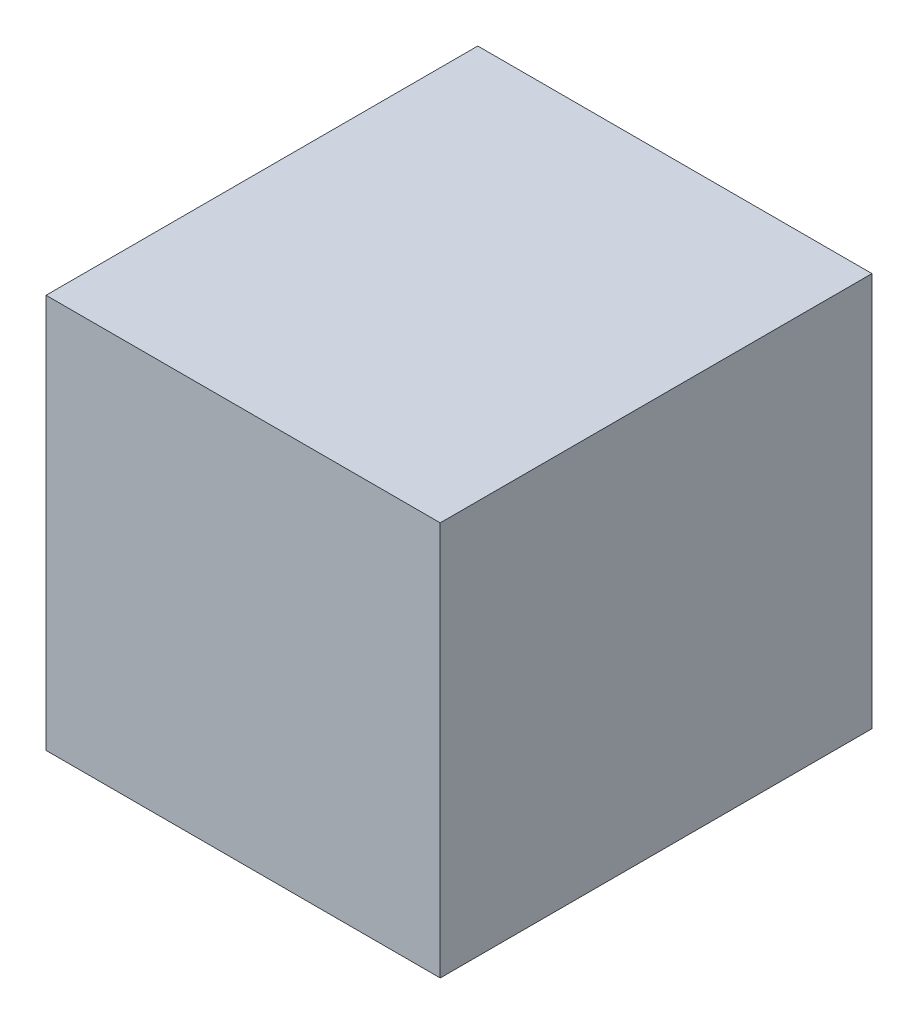
ISO-10303-21;
HEADER;
FILE_DESCRIPTION(('STEP AP214'),'2;1');
FILE_NAME('part.step','',(''),(''),'','','');
FILE_SCHEMA(('AUTOMOTIVE_DESIGN { 1 0 10303 214 1 1 1 1 }'));
ENDSEC;
DATA;
#1=APPLICATION_CONTEXT('core data for automotive mechanical design processes');
#2=APPLICATION_PROTOCOL_DEFINITION('international standard','automotive_design',2000,#1);
#3=PRODUCT_CONTEXT('',#1,'mechanical');
#4=PRODUCT('Part','Part','',(#3));
#5=PRODUCT_RELATED_PRODUCT_CATEGORY('part','',(#4));
#6=PRODUCT_DEFINITION_FORMATION('','',#4);
#7=PRODUCT_DEFINITION_CONTEXT('part definition',#1,'design');
#8=PRODUCT_DEFINITION('design','',#6,#7);
#9=PRODUCT_DEFINITION_SHAPE('','',#8);
#10=(LENGTH_UNIT() NAMED_UNIT(*) SI_UNIT(.MILLI.,.METRE.));
#11=(NAMED_UNIT(*) PLANE_ANGLE_UNIT() SI_UNIT($,.RADIAN.));
#12=(NAMED_UNIT(*) SI_UNIT($,.STERADIAN.) SOLID_ANGLE_UNIT());
#13=UNCERTAINTY_MEASURE_WITH_UNIT(LENGTH_MEASURE(1.E-05),#10,'distance_accuracy_value','');
#14=(GEOMETRIC_REPRESENTATION_CONTEXT(3) GLOBAL_UNCERTAINTY_ASSIGNED_CONTEXT((#13)) GLOBAL_UNIT_ASSIGNED_CONTEXT((#10,
#11,#12)) REPRESENTATION_CONTEXT('',''));
#15=CARTESIAN_POINT('',(0.,0.,0.));
#16=DIRECTION('',(0.,0.,1.));
#17=DIRECTION('',(1.,0.,0.));
#18=AXIS2_PLACEMENT_3D('',#15,#16,#17);
#19=CARTESIAN_POINT('',(52.5,52.5,115.));
#20=DIRECTION('',(-1.,0.,0.));
#21=DIRECTION('',(0.,-1.,0.));
#22=AXIS2_PLACEMENT_3D('',#19,#20,#21);
#23=PLANE('',#22);
#24=DIRECTION('',(0.,1.,0.));
#25=VECTOR('',#24,1.);
#26=CARTESIAN_POINT('',(52.5,52.5,0.));
#27=LINE('',#26,#25);
#28=CARTESIAN_POINT('',(52.5,-52.5,0.));
#29=VERTEX_POINT('',#28);
#30=CARTESIAN_POINT('',(52.5,52.5,0.));
#31=VERTEX_POINT('',#30);
#32=EDGE_CURVE('E96',#29,#31,#27,.T.);
#33=ORIENTED_EDGE('',*,*,#32,.T.);
#34=DIRECTION('',(0.,0.,-1.));
#35=VECTOR('',#34,1.);
#36=CARTESIAN_POINT('',(52.5,52.5,115.));
#37=LINE('',#36,#35);
#38=CARTESIAN_POINT('',(52.5,52.5,115.));
#39=VERTEX_POINT('',#38);
#40=EDGE_CURVE('E11',#39,#31,#37,.T.);
#41=ORIENTED_EDGE('',*,*,#40,.F.);
#42=DIRECTION('',(0.,1.,0.));
#43=VECTOR('',#42,1.);
#44=CARTESIAN_POINT('',(52.5,52.5,115.));
#45=LINE('',#44,#43);
#46=CARTESIAN_POINT('',(52.5,-52.5,115.));
#47=VERTEX_POINT('',#46);
#48=EDGE_CURVE('E84',#47,#39,#45,.T.);
#49=ORIENTED_EDGE('',*,*,#48,.F.);
#50=DIRECTION('',(0.,0.,-1.));
#51=VECTOR('',#50,1.);
#52=CARTESIAN_POINT('',(52.5,-52.5,115.));
#53=LINE('',#52,#51);
#54=EDGE_CURVE('E92',#47,#29,#53,.T.);
#55=ORIENTED_EDGE('',*,*,#54,.T.);
#56=EDGE_LOOP('',(#33,#41,#49,#55));
#57=FACE_BOUND('',#56,.T.);
#58=ADVANCED_FACE('F33',(#57),#23,.F.);
#59=CARTESIAN_POINT('',(-52.5,52.5,115.));
#60=DIRECTION('',(0.,-1.,0.));
#61=DIRECTION('',(0.,0.,-1.));
#62=AXIS2_PLACEMENT_3D('',#59,#60,#61);
#63=PLANE('',#62);
#64=DIRECTION('',(-1.,0.,0.));
#65=VECTOR('',#64,1.);
#66=CARTESIAN_POINT('',(-52.5,52.5,0.));
#67=LINE('',#66,#65);
#68=CARTESIAN_POINT('',(-52.5,52.5,0.));
#69=VERTEX_POINT('',#68);
#70=EDGE_CURVE('E88',#31,#69,#67,.T.);
#71=ORIENTED_EDGE('',*,*,#70,.T.);
#72=DIRECTION('',(0.,0.,-1.));
#73=VECTOR('',#72,1.);
#74=CARTESIAN_POINT('',(-52.5,52.5,115.));
#75=LINE('',#74,#73);
#76=CARTESIAN_POINT('',(-52.5,52.5,115.));
#77=VERTEX_POINT('',#76);
#78=EDGE_CURVE('E41',#77,#69,#75,.T.);
#79=ORIENTED_EDGE('',*,*,#78,.F.);
#80=DIRECTION('',(-1.,0.,0.));
#81=VECTOR('',#80,1.);
#82=CARTESIAN_POINT('',(-52.5,52.5,115.));
#83=LINE('',#82,#81);
#84=EDGE_CURVE('E79',#39,#77,#83,.T.);
#85=ORIENTED_EDGE('',*,*,#84,.F.);
#86=ORIENTED_EDGE('',*,*,#40,.T.);
#87=EDGE_LOOP('',(#71,#79,#85,#86));
#88=FACE_BOUND('',#87,.T.);
#89=ADVANCED_FACE('F87',(#88),#63,.F.);
#90=CARTESIAN_POINT('',(-52.5,52.5,115.));
#91=DIRECTION('',(1.,0.,0.));
#92=DIRECTION('',(0.,1.,0.));
#93=AXIS2_PLACEMENT_3D('',#90,#91,#92);
#94=PLANE('',#93);
#95=DIRECTION('',(0.,-1.,0.));
#96=VECTOR('',#95,1.);
#97=CARTESIAN_POINT('',(-52.5,52.5,0.));
#98=LINE('',#97,#96);
#99=CARTESIAN_POINT('',(-52.5,-52.5,0.));
#100=VERTEX_POINT('',#99);
#101=EDGE_CURVE('E66',#69,#100,#98,.T.);
#102=ORIENTED_EDGE('',*,*,#101,.T.);
#103=DIRECTION('',(0.,0.,-1.));
#104=VECTOR('',#103,1.);
#105=CARTESIAN_POINT('',(-52.5,-52.5,115.));
#106=LINE('',#105,#104);
#107=CARTESIAN_POINT('',(-52.5,-52.5,115.));
#108=VERTEX_POINT('',#107);
#109=EDGE_CURVE('E89',#108,#100,#106,.T.);
#110=ORIENTED_EDGE('',*,*,#109,.F.);
#111=DIRECTION('',(0.,-1.,0.));
#112=VECTOR('',#111,1.);
#113=CARTESIAN_POINT('',(-52.5,52.5,115.));
#114=LINE('',#113,#112);
#115=EDGE_CURVE('E82',#77,#108,#114,.T.);
#116=ORIENTED_EDGE('',*,*,#115,.F.);
#117=ORIENTED_EDGE('',*,*,#78,.T.);
#118=EDGE_LOOP('',(#102,#110,#116,#117));
#119=FACE_BOUND('',#118,.T.);
#120=ADVANCED_FACE('F90',(#119),#94,.F.);
#121=CARTESIAN_POINT('',(-52.5,-52.5,115.));
#122=DIRECTION('',(0.,1.,0.));
#123=DIRECTION('',(0.,0.,1.));
#124=AXIS2_PLACEMENT_3D('',#121,#122,#123);
#125=PLANE('',#124);
#126=DIRECTION('',(1.,0.,0.));
#127=VECTOR('',#126,1.);
#128=CARTESIAN_POINT('',(-52.5,-52.5,0.));
#129=LINE('',#128,#127);
#130=EDGE_CURVE('E72',#100,#29,#129,.T.);
#131=ORIENTED_EDGE('',*,*,#130,.T.);
#132=ORIENTED_EDGE('',*,*,#54,.F.);
#133=DIRECTION('',(1.,0.,0.));
#134=VECTOR('',#133,1.);
#135=CARTESIAN_POINT('',(-52.5,-52.5,115.));
#136=LINE('',#135,#134);
#137=EDGE_CURVE('E49',#108,#47,#136,.T.);
#138=ORIENTED_EDGE('',*,*,#137,.F.);
#139=ORIENTED_EDGE('',*,*,#109,.T.);
#140=EDGE_LOOP('',(#131,#132,#138,#139));
#141=FACE_BOUND('',#140,.T.);
#142=ADVANCED_FACE('F103',(#141),#125,.F.);
#143=CARTESIAN_POINT('',(0.,0.,115.));
#144=DIRECTION('',(0.,0.,1.));
#145=DIRECTION('',(1.,0.,0.));
#146=AXIS2_PLACEMENT_3D('',#143,#144,#145);
#147=PLANE('',#146);
#148=ORIENTED_EDGE('',*,*,#48,.T.);
#149=ORIENTED_EDGE('',*,*,#84,.T.);
#150=ORIENTED_EDGE('',*,*,#115,.T.);
#151=ORIENTED_EDGE('',*,*,#137,.T.);
#152=EDGE_LOOP('',(#148,#149,#150,#151));
#153=FACE_BOUND('',#152,.T.);
#154=ADVANCED_FACE('F80',(#153),#147,.T.);
#155=CARTESIAN_POINT('',(0.,0.,0.));
#156=DIRECTION('',(0.,0.,1.));
#157=DIRECTION('',(1.,0.,0.));
#158=AXIS2_PLACEMENT_3D('',#155,#156,#157);
#159=PLANE('',#158);
#160=ORIENTED_EDGE('',*,*,#32,.F.);
#161=ORIENTED_EDGE('',*,*,#130,.F.);
#162=ORIENTED_EDGE('',*,*,#101,.F.);
#163=ORIENTED_EDGE('',*,*,#70,.F.);
#164=EDGE_LOOP('',(#160,#161,#162,#163));
#165=FACE_BOUND('',#164,.T.);
#166=ADVANCED_FACE('F106',(#165),#159,.F.);
#167=CLOSED_SHELL('',(#58,#89,#120,#142,#154,#166));
#168=MANIFOLD_SOLID_BREP('B2',#167);
#169=ADVANCED_BREP_SHAPE_REPRESENTATION('',(#18,#168),#14);
#170=SHAPE_DEFINITION_REPRESENTATION(#9,#169);
ENDSEC;
END-ISO-10303-21;
